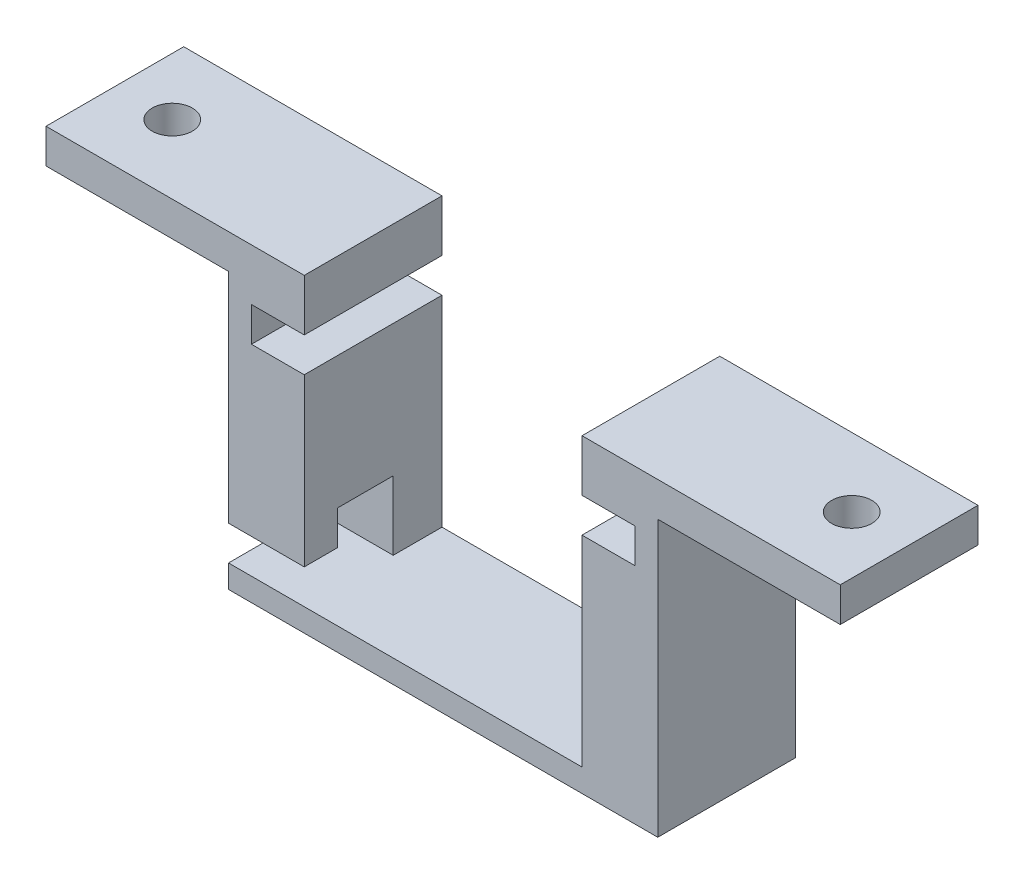
ISO-10303-21;
HEADER;
FILE_DESCRIPTION(('STEP AP214'),'2;1');
FILE_NAME('part.step','',(''),(''),'','','');
FILE_SCHEMA(('AUTOMOTIVE_DESIGN { 1 0 10303 214 1 1 1 1 }'));
ENDSEC;
DATA;
#1=APPLICATION_CONTEXT('core data for automotive mechanical design processes');
#2=APPLICATION_PROTOCOL_DEFINITION('international standard','automotive_design',2000,#1);
#3=PRODUCT_CONTEXT('',#1,'mechanical');
#4=PRODUCT('Part','Part','',(#3));
#5=PRODUCT_RELATED_PRODUCT_CATEGORY('part','',(#4));
#6=PRODUCT_DEFINITION_FORMATION('','',#4);
#7=PRODUCT_DEFINITION_CONTEXT('part definition',#1,'design');
#8=PRODUCT_DEFINITION('design','',#6,#7);
#9=PRODUCT_DEFINITION_SHAPE('','',#8);
#10=(LENGTH_UNIT() NAMED_UNIT(*) SI_UNIT(.MILLI.,.METRE.));
#11=(NAMED_UNIT(*) PLANE_ANGLE_UNIT() SI_UNIT($,.RADIAN.));
#12=(NAMED_UNIT(*) SI_UNIT($,.STERADIAN.) SOLID_ANGLE_UNIT());
#13=UNCERTAINTY_MEASURE_WITH_UNIT(LENGTH_MEASURE(1.E-05),#10,'distance_accuracy_value','');
#14=(GEOMETRIC_REPRESENTATION_CONTEXT(3) GLOBAL_UNCERTAINTY_ASSIGNED_CONTEXT((#13)) GLOBAL_UNIT_ASSIGNED_CONTEXT((#10,
#11,#12)) REPRESENTATION_CONTEXT('',''));
#15=CARTESIAN_POINT('',(0.,0.,0.));
#16=DIRECTION('',(0.,0.,1.));
#17=DIRECTION('',(1.,0.,0.));
#18=AXIS2_PLACEMENT_3D('',#15,#16,#17);
#19=CARTESIAN_POINT('',(-18.7,25.,12.));
#20=DIRECTION('',(1.,0.,0.));
#21=DIRECTION('',(0.,1.,0.));
#22=AXIS2_PLACEMENT_3D('',#19,#20,#21);
#23=PLANE('',#22);
#24=DIRECTION('',(0.,0.,1.));
#25=VECTOR('',#24,1.);
#26=CARTESIAN_POINT('',(-18.7,22.,12.));
#27=LINE('',#26,#25);
#28=CARTESIAN_POINT('',(-18.7,22.,0.));
#29=VERTEX_POINT('',#28);
#30=CARTESIAN_POINT('',(-18.7,22.,12.));
#31=VERTEX_POINT('',#30);
#32=EDGE_CURVE('E59',#29,#31,#27,.T.);
#33=ORIENTED_EDGE('',*,*,#32,.F.);
#34=DIRECTION('',(0.,-1.,0.));
#35=VECTOR('',#34,1.);
#36=CARTESIAN_POINT('',(-18.7,25.,0.));
#37=LINE('',#36,#35);
#38=CARTESIAN_POINT('',(-18.7,-2.,0.));
#39=VERTEX_POINT('',#38);
#40=EDGE_CURVE('E391',#29,#39,#37,.T.);
#41=ORIENTED_EDGE('',*,*,#40,.T.);
#42=DIRECTION('',(0.,0.,-1.));
#43=VECTOR('',#42,1.);
#44=CARTESIAN_POINT('',(-18.7,-2.,12.));
#45=LINE('',#44,#43);
#46=CARTESIAN_POINT('',(-18.7,-2.,12.));
#47=VERTEX_POINT('',#46);
#48=EDGE_CURVE('E48',#47,#39,#45,.T.);
#49=ORIENTED_EDGE('',*,*,#48,.F.);
#50=DIRECTION('',(0.,-1.,0.));
#51=VECTOR('',#50,1.);
#52=CARTESIAN_POINT('',(-18.7,25.,12.));
#53=LINE('',#52,#51);
#54=CARTESIAN_POINT('',(-18.7,0.,12.));
#55=VERTEX_POINT('',#54);
#56=EDGE_CURVE('E342',#55,#47,#53,.T.);
#57=ORIENTED_EDGE('',*,*,#56,.F.);
#58=DIRECTION('',(0.,0.,-1.));
#59=VECTOR('',#58,1.);
#60=CARTESIAN_POINT('',(-18.7,0.,12.));
#61=LINE('',#60,#59);
#62=CARTESIAN_POINT('',(-18.7,0.,4.25));
#63=VERTEX_POINT('',#62);
#64=EDGE_CURVE('E326',#55,#63,#61,.T.);
#65=ORIENTED_EDGE('',*,*,#64,.T.);
#66=DIRECTION('',(0.,1.,0.));
#67=VECTOR('',#66,1.);
#68=CARTESIAN_POINT('',(-18.7,25.,4.25000000000002));
#69=LINE('',#68,#67);
#70=CARTESIAN_POINT('',(-18.7,6.,4.25));
#71=VERTEX_POINT('',#70);
#72=EDGE_CURVE('E330',#63,#71,#69,.T.);
#73=ORIENTED_EDGE('',*,*,#72,.T.);
#74=DIRECTION('',(0.,0.,1.));
#75=VECTOR('',#74,1.);
#76=CARTESIAN_POINT('',(-18.7,6.,12.));
#77=LINE('',#76,#75);
#78=CARTESIAN_POINT('',(-18.7,6.,9.10764955179388));
#79=VERTEX_POINT('',#78);
#80=EDGE_CURVE('E320',#71,#79,#77,.T.);
#81=ORIENTED_EDGE('',*,*,#80,.T.);
#82=DIRECTION('',(0.,1.,0.));
#83=VECTOR('',#82,1.);
#84=CARTESIAN_POINT('',(-18.7,3.,9.10764955179388));
#85=LINE('',#84,#83);
#86=CARTESIAN_POINT('',(-18.7,3.,9.10764955179388));
#87=VERTEX_POINT('',#86);
#88=EDGE_CURVE('E305',#87,#79,#85,.T.);
#89=ORIENTED_EDGE('',*,*,#88,.F.);
#90=DIRECTION('',(0.,0.,-1.));
#91=VECTOR('',#90,1.);
#92=CARTESIAN_POINT('',(-18.7,3.,12.));
#93=LINE('',#92,#91);
#94=CARTESIAN_POINT('',(-18.7,3.,12.));
#95=VERTEX_POINT('',#94);
#96=EDGE_CURVE('E283',#95,#87,#93,.T.);
#97=ORIENTED_EDGE('',*,*,#96,.F.);
#98=EDGE_CURVE('E55',#31,#95,#53,.T.);
#99=ORIENTED_EDGE('',*,*,#98,.F.);
#100=EDGE_LOOP('',(#33,#41,#49,#57,#65,#73,#81,#89,#97,#99));
#101=FACE_BOUND('',#100,.T.);
#102=ADVANCED_FACE('F39',(#101),#23,.F.);
#103=CARTESIAN_POINT('',(-20.1,6.,7.75));
#104=DIRECTION('',(0.,1.,0.));
#105=DIRECTION('',(0.,0.,1.));
#106=AXIS2_PLACEMENT_3D('',#103,#104,#105);
#107=PLANE('',#106);
#108=DIRECTION('',(1.,0.,0.));
#109=VECTOR('',#108,1.);
#110=CARTESIAN_POINT('',(-18.7,6.,9.10764955179388));
#111=LINE('',#110,#109);
#112=CARTESIAN_POINT('',(-12.1,6.,9.10764955179388));
#113=VERTEX_POINT('',#112);
#114=EDGE_CURVE('E282',#79,#113,#111,.T.);
#115=ORIENTED_EDGE('',*,*,#114,.F.);
#116=ORIENTED_EDGE('',*,*,#80,.F.);
#117=DIRECTION('',(1.,0.,0.));
#118=VECTOR('',#117,1.);
#119=CARTESIAN_POINT('',(-20.1,6.,4.25));
#120=LINE('',#119,#118);
#121=CARTESIAN_POINT('',(-12.1,6.,4.25));
#122=VERTEX_POINT('',#121);
#123=EDGE_CURVE('E316',#71,#122,#120,.T.);
#124=ORIENTED_EDGE('',*,*,#123,.T.);
#125=DIRECTION('',(0.,0.,1.));
#126=VECTOR('',#125,1.);
#127=CARTESIAN_POINT('',(-12.1,6.,7.75));
#128=LINE('',#127,#126);
#129=EDGE_CURVE('E313',#122,#113,#128,.T.);
#130=ORIENTED_EDGE('',*,*,#129,.T.);
#131=EDGE_LOOP('',(#115,#116,#124,#130));
#132=FACE_BOUND('',#131,.T.);
#133=ADVANCED_FACE('F509',(#132),#107,.F.);
#134=CARTESIAN_POINT('',(0.,0.,12.));
#135=DIRECTION('',(0.,0.,1.));
#136=DIRECTION('',(1.,0.,0.));
#137=AXIS2_PLACEMENT_3D('',#134,#135,#136);
#138=PLANE('',#137);
#139=DIRECTION('',(0.,1.,0.));
#140=VECTOR('',#139,1.);
#141=CARTESIAN_POINT('',(18.7,-2.,12.));
#142=LINE('',#141,#140);
#143=CARTESIAN_POINT('',(18.7,-2.,12.));
#144=VERTEX_POINT('',#143);
#145=CARTESIAN_POINT('',(18.7,22.,12.));
#146=VERTEX_POINT('',#145);
#147=EDGE_CURVE('E348',#144,#146,#142,.T.);
#148=ORIENTED_EDGE('',*,*,#147,.T.);
#149=DIRECTION('',(1.,0.,0.));
#150=VECTOR('',#149,1.);
#151=CARTESIAN_POINT('',(12.1,22.,12.));
#152=LINE('',#151,#150);
#153=CARTESIAN_POINT('',(34.6,22.,12.));
#154=VERTEX_POINT('',#153);
#155=EDGE_CURVE('E220',#146,#154,#152,.T.);
#156=ORIENTED_EDGE('',*,*,#155,.T.);
#157=DIRECTION('',(0.,1.,0.));
#158=VECTOR('',#157,1.);
#159=CARTESIAN_POINT('',(34.6,22.,12.));
#160=LINE('',#159,#158);
#161=CARTESIAN_POINT('',(34.6,25.,12.));
#162=VERTEX_POINT('',#161);
#163=EDGE_CURVE('E219',#154,#162,#160,.T.);
#164=ORIENTED_EDGE('',*,*,#163,.T.);
#165=DIRECTION('',(-1.,0.,0.));
#166=VECTOR('',#165,1.);
#167=CARTESIAN_POINT('',(12.1,25.,12.));
#168=LINE('',#167,#166);
#169=CARTESIAN_POINT('',(12.1,25.,12.));
#170=VERTEX_POINT('',#169);
#171=EDGE_CURVE('E352',#162,#170,#168,.T.);
#172=ORIENTED_EDGE('',*,*,#171,.T.);
#173=DIRECTION('',(0.,-1.,0.));
#174=VECTOR('',#173,1.);
#175=CARTESIAN_POINT('',(12.1,20.5,12.));
#176=LINE('',#175,#174);
#177=CARTESIAN_POINT('',(12.1,20.5,12.));
#178=VERTEX_POINT('',#177);
#179=EDGE_CURVE('E355',#170,#178,#176,.T.);
#180=ORIENTED_EDGE('',*,*,#179,.T.);
#181=DIRECTION('',(1.,0.,0.));
#182=VECTOR('',#181,1.);
#183=CARTESIAN_POINT('',(16.7,20.5,12.));
#184=LINE('',#183,#182);
#185=CARTESIAN_POINT('',(16.7,20.5,12.));
#186=VERTEX_POINT('',#185);
#187=EDGE_CURVE('E358',#178,#186,#184,.T.);
#188=ORIENTED_EDGE('',*,*,#187,.T.);
#189=DIRECTION('',(0.,-1.,0.));
#190=VECTOR('',#189,1.);
#191=CARTESIAN_POINT('',(16.7,17.5,12.));
#192=LINE('',#191,#190);
#193=CARTESIAN_POINT('',(16.7,17.5,12.));
#194=VERTEX_POINT('',#193);
#195=EDGE_CURVE('E361',#186,#194,#192,.T.);
#196=ORIENTED_EDGE('',*,*,#195,.T.);
#197=DIRECTION('',(-1.,0.,0.));
#198=VECTOR('',#197,1.);
#199=CARTESIAN_POINT('',(12.1,17.5,12.));
#200=LINE('',#199,#198);
#201=CARTESIAN_POINT('',(12.1,17.5,12.));
#202=VERTEX_POINT('',#201);
#203=EDGE_CURVE('E364',#194,#202,#200,.T.);
#204=ORIENTED_EDGE('',*,*,#203,.T.);
#205=DIRECTION('',(0.,-1.,0.));
#206=VECTOR('',#205,1.);
#207=CARTESIAN_POINT('',(12.1,0.,12.));
#208=LINE('',#207,#206);
#209=CARTESIAN_POINT('',(12.1,0.,12.));
#210=VERTEX_POINT('',#209);
#211=EDGE_CURVE('E367',#202,#210,#208,.T.);
#212=ORIENTED_EDGE('',*,*,#211,.T.);
#213=DIRECTION('',(-1.,0.,0.));
#214=VECTOR('',#213,1.);
#215=CARTESIAN_POINT('',(-12.1,0.,12.));
#216=LINE('',#215,#214);
#217=EDGE_CURVE('E370',#210,#55,#216,.T.);
#218=ORIENTED_EDGE('',*,*,#217,.T.);
#219=ORIENTED_EDGE('',*,*,#56,.T.);
#220=DIRECTION('',(1.,0.,0.));
#221=VECTOR('',#220,1.);
#222=CARTESIAN_POINT('',(-18.7,-2.,12.));
#223=LINE('',#222,#221);
#224=EDGE_CURVE('E345',#47,#144,#223,.T.);
#225=ORIENTED_EDGE('',*,*,#224,.T.);
#226=EDGE_LOOP('',(#148,#156,#164,#172,#180,#188,#196,#204,#212,#218,#219,#225));
#227=FACE_BOUND('',#226,.T.);
#228=ADVANCED_FACE('F491',(#227),#138,.T.);
#229=CARTESIAN_POINT('',(-12.1,20.5,12.));
#230=DIRECTION('',(-1.,0.,0.));
#231=DIRECTION('',(0.,-1.,0.));
#232=AXIS2_PLACEMENT_3D('',#229,#230,#231);
#233=PLANE('',#232);
#234=DIRECTION('',(0.,0.,-1.));
#235=VECTOR('',#234,1.);
#236=CARTESIAN_POINT('',(-12.1,25.,12.));
#237=LINE('',#236,#235);
#238=CARTESIAN_POINT('',(-12.1,25.,12.));
#239=VERTEX_POINT('',#238);
#240=CARTESIAN_POINT('',(-12.1,25.,0.));
#241=VERTEX_POINT('',#240);
#242=EDGE_CURVE('E11',#239,#241,#237,.T.);
#243=ORIENTED_EDGE('',*,*,#242,.F.);
#244=DIRECTION('',(0.,1.,0.));
#245=VECTOR('',#244,1.);
#246=CARTESIAN_POINT('',(-12.1,20.5,12.));
#247=LINE('',#246,#245);
#248=CARTESIAN_POINT('',(-12.1,20.5,12.));
#249=VERTEX_POINT('',#248);
#250=EDGE_CURVE('E335',#249,#239,#247,.T.);
#251=ORIENTED_EDGE('',*,*,#250,.F.);
#252=DIRECTION('',(0.,0.,-1.));
#253=VECTOR('',#252,1.);
#254=CARTESIAN_POINT('',(-12.1,20.5,12.));
#255=LINE('',#254,#253);
#256=CARTESIAN_POINT('',(-12.1,20.5,0.));
#257=VERTEX_POINT('',#256);
#258=EDGE_CURVE('E385',#249,#257,#255,.T.);
#259=ORIENTED_EDGE('',*,*,#258,.T.);
#260=DIRECTION('',(0.,1.,0.));
#261=VECTOR('',#260,1.);
#262=CARTESIAN_POINT('',(-12.1,20.5,0.));
#263=LINE('',#262,#261);
#264=EDGE_CURVE('E334',#257,#241,#263,.T.);
#265=ORIENTED_EDGE('',*,*,#264,.T.);
#266=EDGE_LOOP('',(#243,#251,#259,#265));
#267=FACE_BOUND('',#266,.T.);
#268=ADVANCED_FACE('F41',(#267),#233,.F.);
#269=CARTESIAN_POINT('',(-12.1,25.,12.));
#270=DIRECTION('',(0.,-1.,0.));
#271=DIRECTION('',(1.,0.,0.));
#272=AXIS2_PLACEMENT_3D('',#269,#270,#271);
#273=PLANE('',#272);
#274=DIRECTION('',(-1.,0.,0.));
#275=VECTOR('',#274,1.);
#276=CARTESIAN_POINT('',(-12.1,25.,0.));
#277=LINE('',#276,#275);
#278=CARTESIAN_POINT('',(-34.6,25.,0.));
#279=VERTEX_POINT('',#278);
#280=EDGE_CURVE('E388',#241,#279,#277,.T.);
#281=ORIENTED_EDGE('',*,*,#280,.T.);
#282=DIRECTION('',(0.,0.,1.));
#283=VECTOR('',#282,1.);
#284=CARTESIAN_POINT('',(-34.6,25.,12.));
#285=LINE('',#284,#283);
#286=CARTESIAN_POINT('',(-34.6,25.,12.));
#287=VERTEX_POINT('',#286);
#288=EDGE_CURVE('E254',#279,#287,#285,.T.);
#289=ORIENTED_EDGE('',*,*,#288,.T.);
#290=DIRECTION('',(-1.,0.,0.));
#291=VECTOR('',#290,1.);
#292=CARTESIAN_POINT('',(-12.1,25.,12.));
#293=LINE('',#292,#291);
#294=EDGE_CURVE('E338',#239,#287,#293,.T.);
#295=ORIENTED_EDGE('',*,*,#294,.F.);
#296=ORIENTED_EDGE('',*,*,#242,.T.);
#297=EDGE_LOOP('',(#281,#289,#295,#296));
#298=FACE_BOUND('',#297,.T.);
#299=CARTESIAN_POINT('',(-29.6,25.,6.));
#300=DIRECTION('',(0.,1.,0.));
#301=DIRECTION('',(-1.,0.,0.));
#302=AXIS2_PLACEMENT_3D('',#299,#300,#301);
#303=CIRCLE('',#302,1.75);
#304=CARTESIAN_POINT('',(-31.35,25.,6.));
#305=VERTEX_POINT('',#304);
#306=EDGE_CURVE('E249',#305,#305,#303,.T.);
#307=ORIENTED_EDGE('',*,*,#306,.F.);
#308=EDGE_LOOP('',(#307));
#309=FACE_BOUND('',#308,.T.);
#310=ADVANCED_FACE('F530',(#298,#309),#273,.F.);
#311=CARTESIAN_POINT('',(-18.7,-2.,12.));
#312=DIRECTION('',(0.,1.,0.));
#313=DIRECTION('',(0.,0.,1.));
#314=AXIS2_PLACEMENT_3D('',#311,#312,#313);
#315=PLANE('',#314);
#316=DIRECTION('',(1.,0.,0.));
#317=VECTOR('',#316,1.);
#318=CARTESIAN_POINT('',(-18.7,-2.,0.));
#319=LINE('',#318,#317);
#320=CARTESIAN_POINT('',(18.7,-2.,0.));
#321=VERTEX_POINT('',#320);
#322=EDGE_CURVE('E394',#39,#321,#319,.T.);
#323=ORIENTED_EDGE('',*,*,#322,.T.);
#324=DIRECTION('',(0.,0.,-1.));
#325=VECTOR('',#324,1.);
#326=CARTESIAN_POINT('',(18.7,-2.,12.));
#327=LINE('',#326,#325);
#328=EDGE_CURVE('E474',#144,#321,#327,.T.);
#329=ORIENTED_EDGE('',*,*,#328,.F.);
#330=ORIENTED_EDGE('',*,*,#224,.F.);
#331=ORIENTED_EDGE('',*,*,#48,.T.);
#332=EDGE_LOOP('',(#323,#329,#330,#331));
#333=FACE_BOUND('',#332,.T.);
#334=ADVANCED_FACE('F483',(#333),#315,.F.);
#335=CARTESIAN_POINT('',(18.7,-2.,12.));
#336=DIRECTION('',(-1.,0.,0.));
#337=DIRECTION('',(0.,-1.,0.));
#338=AXIS2_PLACEMENT_3D('',#335,#336,#337);
#339=PLANE('',#338);
#340=DIRECTION('',(0.,1.,0.));
#341=VECTOR('',#340,1.);
#342=CARTESIAN_POINT('',(18.7,-2.,0.));
#343=LINE('',#342,#341);
#344=CARTESIAN_POINT('',(18.7,22.,0.));
#345=VERTEX_POINT('',#344);
#346=EDGE_CURVE('E397',#321,#345,#343,.T.);
#347=ORIENTED_EDGE('',*,*,#346,.T.);
#348=DIRECTION('',(0.,0.,1.));
#349=VECTOR('',#348,1.);
#350=CARTESIAN_POINT('',(18.7,22.,12.));
#351=LINE('',#350,#349);
#352=EDGE_CURVE('E227',#345,#146,#351,.T.);
#353=ORIENTED_EDGE('',*,*,#352,.T.);
#354=ORIENTED_EDGE('',*,*,#147,.F.);
#355=ORIENTED_EDGE('',*,*,#328,.T.);
#356=EDGE_LOOP('',(#347,#353,#354,#355));
#357=FACE_BOUND('',#356,.T.);
#358=ADVANCED_FACE('F488',(#357),#339,.F.);
#359=CARTESIAN_POINT('',(12.1,25.,12.));
#360=DIRECTION('',(0.,-1.,0.));
#361=DIRECTION('',(1.,0.,0.));
#362=AXIS2_PLACEMENT_3D('',#359,#360,#361);
#363=PLANE('',#362);
#364=DIRECTION('',(-1.,0.,0.));
#365=VECTOR('',#364,1.);
#366=CARTESIAN_POINT('',(12.1,25.,0.));
#367=LINE('',#366,#365);
#368=CARTESIAN_POINT('',(34.6,25.,0.));
#369=VERTEX_POINT('',#368);
#370=CARTESIAN_POINT('',(12.1,25.,0.));
#371=VERTEX_POINT('',#370);
#372=EDGE_CURVE('E213',#369,#371,#367,.T.);
#373=ORIENTED_EDGE('',*,*,#372,.T.);
#374=DIRECTION('',(0.,0.,-1.));
#375=VECTOR('',#374,1.);
#376=CARTESIAN_POINT('',(12.1,25.,12.));
#377=LINE('',#376,#375);
#378=EDGE_CURVE('E470',#170,#371,#377,.T.);
#379=ORIENTED_EDGE('',*,*,#378,.F.);
#380=ORIENTED_EDGE('',*,*,#171,.F.);
#381=DIRECTION('',(0.,0.,-1.));
#382=VECTOR('',#381,1.);
#383=CARTESIAN_POINT('',(34.6,25.,12.));
#384=LINE('',#383,#382);
#385=EDGE_CURVE('E234',#162,#369,#384,.T.);
#386=ORIENTED_EDGE('',*,*,#385,.T.);
#387=EDGE_LOOP('',(#373,#379,#380,#386));
#388=FACE_BOUND('',#387,.T.);
#389=CARTESIAN_POINT('',(29.6,25.,6.));
#390=DIRECTION('',(0.,1.,0.));
#391=DIRECTION('',(-1.,0.,0.));
#392=AXIS2_PLACEMENT_3D('',#389,#390,#391);
#393=CIRCLE('',#392,1.75);
#394=CARTESIAN_POINT('',(27.85,25.,6.));
#395=VERTEX_POINT('',#394);
#396=EDGE_CURVE('E240',#395,#395,#393,.T.);
#397=ORIENTED_EDGE('',*,*,#396,.F.);
#398=EDGE_LOOP('',(#397));
#399=FACE_BOUND('',#398,.T.);
#400=ADVANCED_FACE('F661',(#388,#399),#363,.F.);
#401=CARTESIAN_POINT('',(12.1,20.5,12.));
#402=DIRECTION('',(1.,0.,0.));
#403=DIRECTION('',(0.,1.,0.));
#404=AXIS2_PLACEMENT_3D('',#401,#402,#403);
#405=PLANE('',#404);
#406=DIRECTION('',(0.,0.,-1.));
#407=VECTOR('',#406,1.);
#408=CARTESIAN_POINT('',(12.1,20.5,12.));
#409=LINE('',#408,#407);
#410=CARTESIAN_POINT('',(12.1,20.5,0.));
#411=VERTEX_POINT('',#410);
#412=EDGE_CURVE('E466',#178,#411,#409,.T.);
#413=ORIENTED_EDGE('',*,*,#412,.F.);
#414=ORIENTED_EDGE('',*,*,#179,.F.);
#415=ORIENTED_EDGE('',*,*,#378,.T.);
#416=DIRECTION('',(0.,-1.,0.));
#417=VECTOR('',#416,1.);
#418=CARTESIAN_POINT('',(12.1,20.5,0.));
#419=LINE('',#418,#417);
#420=EDGE_CURVE('E402',#371,#411,#419,.T.);
#421=ORIENTED_EDGE('',*,*,#420,.T.);
#422=EDGE_LOOP('',(#413,#414,#415,#421));
#423=FACE_BOUND('',#422,.T.);
#424=ADVANCED_FACE('F642',(#423),#405,.F.);
#425=CARTESIAN_POINT('',(16.7,20.5,12.));
#426=DIRECTION('',(0.,1.,0.));
#427=DIRECTION('',(-1.,0.,0.));
#428=AXIS2_PLACEMENT_3D('',#425,#426,#427);
#429=PLANE('',#428);
#430=DIRECTION('',(1.,0.,0.));
#431=VECTOR('',#430,1.);
#432=CARTESIAN_POINT('',(16.7,20.5,0.));
#433=LINE('',#432,#431);
#434=CARTESIAN_POINT('',(16.7,20.5,0.));
#435=VERTEX_POINT('',#434);
#436=EDGE_CURVE('E405',#411,#435,#433,.T.);
#437=ORIENTED_EDGE('',*,*,#436,.T.);
#438=DIRECTION('',(0.,0.,-1.));
#439=VECTOR('',#438,1.);
#440=CARTESIAN_POINT('',(16.7,20.5,12.));
#441=LINE('',#440,#439);
#442=EDGE_CURVE('E462',#186,#435,#441,.T.);
#443=ORIENTED_EDGE('',*,*,#442,.F.);
#444=ORIENTED_EDGE('',*,*,#187,.F.);
#445=ORIENTED_EDGE('',*,*,#412,.T.);
#446=EDGE_LOOP('',(#437,#443,#444,#445));
#447=FACE_BOUND('',#446,.T.);
#448=ADVANCED_FACE('F632',(#447),#429,.F.);
#449=CARTESIAN_POINT('',(16.7,17.5,12.));
#450=DIRECTION('',(1.,0.,0.));
#451=DIRECTION('',(0.,0.,-1.));
#452=AXIS2_PLACEMENT_3D('',#449,#450,#451);
#453=PLANE('',#452);
#454=DIRECTION('',(0.,-1.,0.));
#455=VECTOR('',#454,1.);
#456=CARTESIAN_POINT('',(16.7,17.5,0.));
#457=LINE('',#456,#455);
#458=CARTESIAN_POINT('',(16.7,17.5,0.));
#459=VERTEX_POINT('',#458);
#460=EDGE_CURVE('E408',#435,#459,#457,.T.);
#461=ORIENTED_EDGE('',*,*,#460,.T.);
#462=DIRECTION('',(0.,0.,-1.));
#463=VECTOR('',#462,1.);
#464=CARTESIAN_POINT('',(16.7,17.5,12.));
#465=LINE('',#464,#463);
#466=EDGE_CURVE('E458',#194,#459,#465,.T.);
#467=ORIENTED_EDGE('',*,*,#466,.F.);
#468=ORIENTED_EDGE('',*,*,#195,.F.);
#469=ORIENTED_EDGE('',*,*,#442,.T.);
#470=EDGE_LOOP('',(#461,#467,#468,#469));
#471=FACE_BOUND('',#470,.T.);
#472=ADVANCED_FACE('F622',(#471),#453,.F.);
#473=CARTESIAN_POINT('',(12.1,17.5,12.));
#474=DIRECTION('',(0.,-1.,0.));
#475=DIRECTION('',(0.,0.,-1.));
#476=AXIS2_PLACEMENT_3D('',#473,#474,#475);
#477=PLANE('',#476);
#478=DIRECTION('',(-1.,0.,0.));
#479=VECTOR('',#478,1.);
#480=CARTESIAN_POINT('',(12.1,17.5,0.));
#481=LINE('',#480,#479);
#482=CARTESIAN_POINT('',(12.1,17.5,0.));
#483=VERTEX_POINT('',#482);
#484=EDGE_CURVE('E411',#459,#483,#481,.T.);
#485=ORIENTED_EDGE('',*,*,#484,.T.);
#486=DIRECTION('',(0.,0.,-1.));
#487=VECTOR('',#486,1.);
#488=CARTESIAN_POINT('',(12.1,17.5,12.));
#489=LINE('',#488,#487);
#490=EDGE_CURVE('E454',#202,#483,#489,.T.);
#491=ORIENTED_EDGE('',*,*,#490,.F.);
#492=ORIENTED_EDGE('',*,*,#203,.F.);
#493=ORIENTED_EDGE('',*,*,#466,.T.);
#494=EDGE_LOOP('',(#485,#491,#492,#493));
#495=FACE_BOUND('',#494,.T.);
#496=ADVANCED_FACE('F610',(#495),#477,.F.);
#497=CARTESIAN_POINT('',(12.1,0.,12.));
#498=DIRECTION('',(1.,0.,0.));
#499=DIRECTION('',(0.,1.,0.));
#500=AXIS2_PLACEMENT_3D('',#497,#498,#499);
#501=PLANE('',#500);
#502=DIRECTION('',(0.,-1.,0.));
#503=VECTOR('',#502,1.);
#504=CARTESIAN_POINT('',(12.1,0.,0.));
#505=LINE('',#504,#503);
#506=CARTESIAN_POINT('',(12.1,0.,0.));
#507=VERTEX_POINT('',#506);
#508=EDGE_CURVE('E414',#483,#507,#505,.T.);
#509=ORIENTED_EDGE('',*,*,#508,.T.);
#510=DIRECTION('',(0.,0.,-1.));
#511=VECTOR('',#510,1.);
#512=CARTESIAN_POINT('',(12.1,0.,12.));
#513=LINE('',#512,#511);
#514=EDGE_CURVE('E450',#210,#507,#513,.T.);
#515=ORIENTED_EDGE('',*,*,#514,.F.);
#516=ORIENTED_EDGE('',*,*,#211,.F.);
#517=ORIENTED_EDGE('',*,*,#490,.T.);
#518=EDGE_LOOP('',(#509,#515,#516,#517));
#519=FACE_BOUND('',#518,.T.);
#520=ADVANCED_FACE('F605',(#519),#501,.F.);
#521=CARTESIAN_POINT('',(-12.1,0.,12.));
#522=DIRECTION('',(0.,-1.,0.));
#523=DIRECTION('',(1.,0.,0.));
#524=AXIS2_PLACEMENT_3D('',#521,#522,#523);
#525=PLANE('',#524);
#526=DIRECTION('',(-1.,0.,0.));
#527=VECTOR('',#526,1.);
#528=CARTESIAN_POINT('',(-12.1,0.,0.));
#529=LINE('',#528,#527);
#530=CARTESIAN_POINT('',(-12.1,0.,0.));
#531=VERTEX_POINT('',#530);
#532=EDGE_CURVE('E417',#507,#531,#529,.T.);
#533=ORIENTED_EDGE('',*,*,#532,.T.);
#534=DIRECTION('',(0.,0.,-1.));
#535=VECTOR('',#534,1.);
#536=CARTESIAN_POINT('',(-12.1,0.,12.));
#537=LINE('',#536,#535);
#538=CARTESIAN_POINT('',(-12.1,0.,4.25));
#539=VERTEX_POINT('',#538);
#540=EDGE_CURVE('E447',#539,#531,#537,.T.);
#541=ORIENTED_EDGE('',*,*,#540,.F.);
#542=DIRECTION('',(1.,0.,0.));
#543=VECTOR('',#542,1.);
#544=CARTESIAN_POINT('',(-20.1,0.,4.25));
#545=LINE('',#544,#543);
#546=EDGE_CURVE('E317',#63,#539,#545,.T.);
#547=ORIENTED_EDGE('',*,*,#546,.F.);
#548=ORIENTED_EDGE('',*,*,#64,.F.);
#549=ORIENTED_EDGE('',*,*,#217,.F.);
#550=ORIENTED_EDGE('',*,*,#514,.T.);
#551=EDGE_LOOP('',(#533,#541,#547,#548,#549,#550));
#552=FACE_BOUND('',#551,.T.);
#553=ADVANCED_FACE('F497',(#552),#525,.F.);
#554=CARTESIAN_POINT('',(-12.1,0.,12.));
#555=DIRECTION('',(-1.,0.,0.));
#556=DIRECTION('',(0.,0.,1.));
#557=AXIS2_PLACEMENT_3D('',#554,#555,#556);
#558=PLANE('',#557);
#559=ORIENTED_EDGE('',*,*,#129,.F.);
#560=DIRECTION('',(0.,1.,0.));
#561=VECTOR('',#560,1.);
#562=CARTESIAN_POINT('',(-12.1,0.,4.25));
#563=LINE('',#562,#561);
#564=EDGE_CURVE('E309',#539,#122,#563,.T.);
#565=ORIENTED_EDGE('',*,*,#564,.F.);
#566=ORIENTED_EDGE('',*,*,#540,.T.);
#567=DIRECTION('',(0.,1.,0.));
#568=VECTOR('',#567,1.);
#569=CARTESIAN_POINT('',(-12.1,0.,0.));
#570=LINE('',#569,#568);
#571=CARTESIAN_POINT('',(-12.1,17.5,0.));
#572=VERTEX_POINT('',#571);
#573=EDGE_CURVE('E421',#531,#572,#570,.T.);
#574=ORIENTED_EDGE('',*,*,#573,.T.);
#575=DIRECTION('',(0.,0.,-1.));
#576=VECTOR('',#575,1.);
#577=CARTESIAN_POINT('',(-12.1,17.5,12.));
#578=LINE('',#577,#576);
#579=CARTESIAN_POINT('',(-12.1,17.5,12.));
#580=VERTEX_POINT('',#579);
#581=EDGE_CURVE('E443',#580,#572,#578,.T.);
#582=ORIENTED_EDGE('',*,*,#581,.F.);
#583=DIRECTION('',(0.,1.,0.));
#584=VECTOR('',#583,1.);
#585=CARTESIAN_POINT('',(-12.1,0.,12.));
#586=LINE('',#585,#584);
#587=CARTESIAN_POINT('',(-12.1,3.,12.));
#588=VERTEX_POINT('',#587);
#589=EDGE_CURVE('E373',#588,#580,#586,.T.);
#590=ORIENTED_EDGE('',*,*,#589,.F.);
#591=DIRECTION('',(0.,0.,1.));
#592=VECTOR('',#591,1.);
#593=CARTESIAN_POINT('',(-12.1,3.,12.));
#594=LINE('',#593,#592);
#595=CARTESIAN_POINT('',(-12.1,3.,9.10764955179388));
#596=VERTEX_POINT('',#595);
#597=EDGE_CURVE('E290',#596,#588,#594,.T.);
#598=ORIENTED_EDGE('',*,*,#597,.F.);
#599=DIRECTION('',(0.,1.,0.));
#600=VECTOR('',#599,1.);
#601=CARTESIAN_POINT('',(-12.1,3.,9.10764955179388));
#602=LINE('',#601,#600);
#603=EDGE_CURVE('E298',#596,#113,#602,.T.);
#604=ORIENTED_EDGE('',*,*,#603,.T.);
#605=EDGE_LOOP('',(#559,#565,#566,#574,#582,#590,#598,#604));
#606=FACE_BOUND('',#605,.T.);
#607=ADVANCED_FACE('F505',(#606),#558,.F.);
#608=CARTESIAN_POINT('',(-12.1,17.5,12.));
#609=DIRECTION('',(0.,-1.,0.));
#610=DIRECTION('',(0.,0.,-1.));
#611=AXIS2_PLACEMENT_3D('',#608,#609,#610);
#612=PLANE('',#611);
#613=DIRECTION('',(-1.,0.,0.));
#614=VECTOR('',#613,1.);
#615=CARTESIAN_POINT('',(-12.1,17.5,0.));
#616=LINE('',#615,#614);
#617=CARTESIAN_POINT('',(-16.7,17.5,0.));
#618=VERTEX_POINT('',#617);
#619=EDGE_CURVE('E424',#572,#618,#616,.T.);
#620=ORIENTED_EDGE('',*,*,#619,.T.);
#621=DIRECTION('',(0.,0.,-1.));
#622=VECTOR('',#621,1.);
#623=CARTESIAN_POINT('',(-16.7,17.5,12.));
#624=LINE('',#623,#622);
#625=CARTESIAN_POINT('',(-16.7,17.5,12.));
#626=VERTEX_POINT('',#625);
#627=EDGE_CURVE('E439',#626,#618,#624,.T.);
#628=ORIENTED_EDGE('',*,*,#627,.F.);
#629=DIRECTION('',(-1.,0.,0.));
#630=VECTOR('',#629,1.);
#631=CARTESIAN_POINT('',(-12.1,17.5,12.));
#632=LINE('',#631,#630);
#633=EDGE_CURVE('E376',#580,#626,#632,.T.);
#634=ORIENTED_EDGE('',*,*,#633,.F.);
#635=ORIENTED_EDGE('',*,*,#581,.T.);
#636=EDGE_LOOP('',(#620,#628,#634,#635));
#637=FACE_BOUND('',#636,.T.);
#638=ADVANCED_FACE('F551',(#637),#612,.F.);
#639=CARTESIAN_POINT('',(-16.7,17.5,12.));
#640=DIRECTION('',(-1.,0.,0.));
#641=DIRECTION('',(0.,0.,1.));
#642=AXIS2_PLACEMENT_3D('',#639,#640,#641);
#643=PLANE('',#642);
#644=DIRECTION('',(0.,1.,0.));
#645=VECTOR('',#644,1.);
#646=CARTESIAN_POINT('',(-16.7,17.5,0.));
#647=LINE('',#646,#645);
#648=CARTESIAN_POINT('',(-16.7,20.5,0.));
#649=VERTEX_POINT('',#648);
#650=EDGE_CURVE('E427',#618,#649,#647,.T.);
#651=ORIENTED_EDGE('',*,*,#650,.T.);
#652=DIRECTION('',(0.,0.,-1.));
#653=VECTOR('',#652,1.);
#654=CARTESIAN_POINT('',(-16.7,20.5,12.));
#655=LINE('',#654,#653);
#656=CARTESIAN_POINT('',(-16.7,20.5,12.));
#657=VERTEX_POINT('',#656);
#658=EDGE_CURVE('E435',#657,#649,#655,.T.);
#659=ORIENTED_EDGE('',*,*,#658,.F.);
#660=DIRECTION('',(0.,1.,0.));
#661=VECTOR('',#660,1.);
#662=CARTESIAN_POINT('',(-16.7,17.5,12.));
#663=LINE('',#662,#661);
#664=EDGE_CURVE('E379',#626,#657,#663,.T.);
#665=ORIENTED_EDGE('',*,*,#664,.F.);
#666=ORIENTED_EDGE('',*,*,#627,.T.);
#667=EDGE_LOOP('',(#651,#659,#665,#666));
#668=FACE_BOUND('',#667,.T.);
#669=ADVANCED_FACE('F545',(#668),#643,.F.);
#670=CARTESIAN_POINT('',(-16.7,20.5,12.));
#671=DIRECTION('',(0.,1.,0.));
#672=DIRECTION('',(0.,0.,1.));
#673=AXIS2_PLACEMENT_3D('',#670,#671,#672);
#674=PLANE('',#673);
#675=DIRECTION('',(1.,0.,0.));
#676=VECTOR('',#675,1.);
#677=CARTESIAN_POINT('',(-16.7,20.5,0.));
#678=LINE('',#677,#676);
#679=EDGE_CURVE('E339',#649,#257,#678,.T.);
#680=ORIENTED_EDGE('',*,*,#679,.T.);
#681=ORIENTED_EDGE('',*,*,#258,.F.);
#682=DIRECTION('',(1.,0.,0.));
#683=VECTOR('',#682,1.);
#684=CARTESIAN_POINT('',(-16.7,20.5,12.));
#685=LINE('',#684,#683);
#686=EDGE_CURVE('E382',#657,#249,#685,.T.);
#687=ORIENTED_EDGE('',*,*,#686,.F.);
#688=ORIENTED_EDGE('',*,*,#658,.T.);
#689=EDGE_LOOP('',(#680,#681,#687,#688));
#690=FACE_BOUND('',#689,.T.);
#691=ADVANCED_FACE('F541',(#690),#674,.F.);
#692=ORIENTED_EDGE('',*,*,#294,.T.);
#693=DIRECTION('',(0.,1.,0.));
#694=VECTOR('',#693,1.);
#695=CARTESIAN_POINT('',(-34.6,22.,12.));
#696=LINE('',#695,#694);
#697=CARTESIAN_POINT('',(-34.6,22.,12.));
#698=VERTEX_POINT('',#697);
#699=EDGE_CURVE('E273',#698,#287,#696,.T.);
#700=ORIENTED_EDGE('',*,*,#699,.F.);
#701=DIRECTION('',(1.,0.,0.));
#702=VECTOR('',#701,1.);
#703=CARTESIAN_POINT('',(-12.1,22.,12.));
#704=LINE('',#703,#702);
#705=EDGE_CURVE('E265',#698,#31,#704,.T.);
#706=ORIENTED_EDGE('',*,*,#705,.T.);
#707=ORIENTED_EDGE('',*,*,#98,.T.);
#708=DIRECTION('',(-1.,0.,0.));
#709=VECTOR('',#708,1.);
#710=CARTESIAN_POINT('',(-18.7,3.,12.));
#711=LINE('',#710,#709);
#712=EDGE_CURVE('E294',#588,#95,#711,.T.);
#713=ORIENTED_EDGE('',*,*,#712,.F.);
#714=ORIENTED_EDGE('',*,*,#589,.T.);
#715=ORIENTED_EDGE('',*,*,#633,.T.);
#716=ORIENTED_EDGE('',*,*,#664,.T.);
#717=ORIENTED_EDGE('',*,*,#686,.T.);
#718=ORIENTED_EDGE('',*,*,#250,.T.);
#719=EDGE_LOOP('',(#692,#700,#706,#707,#713,#714,#715,#716,#717,#718));
#720=FACE_BOUND('',#719,.T.);
#721=ADVANCED_FACE('F517',(#720),#138,.T.);
#722=CARTESIAN_POINT('',(0.,0.,0.));
#723=DIRECTION('',(0.,0.,1.));
#724=DIRECTION('',(1.,0.,0.));
#725=AXIS2_PLACEMENT_3D('',#722,#723,#724);
#726=PLANE('',#725);
#727=ORIENTED_EDGE('',*,*,#436,.F.);
#728=ORIENTED_EDGE('',*,*,#420,.F.);
#729=ORIENTED_EDGE('',*,*,#372,.F.);
#730=DIRECTION('',(0.,1.,0.));
#731=VECTOR('',#730,1.);
#732=CARTESIAN_POINT('',(34.6,22.,0.));
#733=LINE('',#732,#731);
#734=CARTESIAN_POINT('',(34.6,22.,0.));
#735=VERTEX_POINT('',#734);
#736=EDGE_CURVE('E205',#735,#369,#733,.T.);
#737=ORIENTED_EDGE('',*,*,#736,.F.);
#738=DIRECTION('',(-1.,0.,0.));
#739=VECTOR('',#738,1.);
#740=CARTESIAN_POINT('',(12.1,22.,0.));
#741=LINE('',#740,#739);
#742=EDGE_CURVE('E210',#735,#345,#741,.T.);
#743=ORIENTED_EDGE('',*,*,#742,.T.);
#744=ORIENTED_EDGE('',*,*,#346,.F.);
#745=ORIENTED_EDGE('',*,*,#322,.F.);
#746=ORIENTED_EDGE('',*,*,#40,.F.);
#747=DIRECTION('',(-1.,0.,0.));
#748=VECTOR('',#747,1.);
#749=CARTESIAN_POINT('',(-12.1,22.,0.));
#750=LINE('',#749,#748);
#751=CARTESIAN_POINT('',(-34.6,22.,0.));
#752=VERTEX_POINT('',#751);
#753=EDGE_CURVE('E258',#29,#752,#750,.T.);
#754=ORIENTED_EDGE('',*,*,#753,.T.);
#755=DIRECTION('',(0.,1.,0.));
#756=VECTOR('',#755,1.);
#757=CARTESIAN_POINT('',(-34.6,22.,0.));
#758=LINE('',#757,#756);
#759=EDGE_CURVE('E269',#752,#279,#758,.T.);
#760=ORIENTED_EDGE('',*,*,#759,.T.);
#761=ORIENTED_EDGE('',*,*,#280,.F.);
#762=ORIENTED_EDGE('',*,*,#264,.F.);
#763=ORIENTED_EDGE('',*,*,#679,.F.);
#764=ORIENTED_EDGE('',*,*,#650,.F.);
#765=ORIENTED_EDGE('',*,*,#619,.F.);
#766=ORIENTED_EDGE('',*,*,#573,.F.);
#767=ORIENTED_EDGE('',*,*,#532,.F.);
#768=ORIENTED_EDGE('',*,*,#508,.F.);
#769=ORIENTED_EDGE('',*,*,#484,.F.);
#770=ORIENTED_EDGE('',*,*,#460,.F.);
#771=EDGE_LOOP('',(#727,#728,#729,#737,#743,#744,#745,#746,#754,#760,#761,#762,#763,#764,#765,
#766,#767,#768,#769,#770));
#772=FACE_BOUND('',#771,.T.);
#773=ADVANCED_FACE('F208',(#772),#726,.F.);
#774=CARTESIAN_POINT('',(-20.1,0.,4.25));
#775=DIRECTION('',(0.,0.,-1.));
#776=DIRECTION('',(0.,1.,0.));
#777=AXIS2_PLACEMENT_3D('',#774,#775,#776);
#778=PLANE('',#777);
#779=ORIENTED_EDGE('',*,*,#546,.T.);
#780=ORIENTED_EDGE('',*,*,#564,.T.);
#781=ORIENTED_EDGE('',*,*,#123,.F.);
#782=ORIENTED_EDGE('',*,*,#72,.F.);
#783=EDGE_LOOP('',(#779,#780,#781,#782));
#784=FACE_BOUND('',#783,.T.);
#785=ADVANCED_FACE('F501',(#784),#778,.F.);
#786=CARTESIAN_POINT('',(-18.7,3.,9.10764955179388));
#787=DIRECTION('',(0.,0.,1.));
#788=DIRECTION('',(1.,0.,0.));
#789=AXIS2_PLACEMENT_3D('',#786,#787,#788);
#790=PLANE('',#789);
#791=ORIENTED_EDGE('',*,*,#114,.T.);
#792=ORIENTED_EDGE('',*,*,#603,.F.);
#793=DIRECTION('',(1.,0.,0.));
#794=VECTOR('',#793,1.);
#795=CARTESIAN_POINT('',(-18.7,3.,9.10764955179388));
#796=LINE('',#795,#794);
#797=EDGE_CURVE('E287',#87,#596,#796,.T.);
#798=ORIENTED_EDGE('',*,*,#797,.F.);
#799=ORIENTED_EDGE('',*,*,#88,.T.);
#800=EDGE_LOOP('',(#791,#792,#798,#799));
#801=FACE_BOUND('',#800,.T.);
#802=ADVANCED_FACE('F511',(#801),#790,.F.);
#803=CARTESIAN_POINT('',(0.,3.,0.));
#804=DIRECTION('',(0.,-1.,0.));
#805=DIRECTION('',(0.,0.,-1.));
#806=AXIS2_PLACEMENT_3D('',#803,#804,#805);
#807=PLANE('',#806);
#808=ORIENTED_EDGE('',*,*,#96,.T.);
#809=ORIENTED_EDGE('',*,*,#797,.T.);
#810=ORIENTED_EDGE('',*,*,#597,.T.);
#811=ORIENTED_EDGE('',*,*,#712,.T.);
#812=EDGE_LOOP('',(#808,#809,#810,#811));
#813=FACE_BOUND('',#812,.T.);
#814=ADVANCED_FACE('F514',(#813),#807,.T.);
#815=CARTESIAN_POINT('',(0.,22.,0.));
#816=DIRECTION('',(0.,1.,0.));
#817=DIRECTION('',(-1.,0.,0.));
#818=AXIS2_PLACEMENT_3D('',#815,#816,#817);
#819=PLANE('',#818);
#820=CARTESIAN_POINT('',(-29.6,22.,6.));
#821=DIRECTION('',(0.,1.,0.));
#822=DIRECTION('',(-1.,0.,0.));
#823=AXIS2_PLACEMENT_3D('',#820,#821,#822);
#824=CIRCLE('',#823,1.75);
#825=CARTESIAN_POINT('',(-31.35,22.,6.));
#826=VERTEX_POINT('',#825);
#827=EDGE_CURVE('E250',#826,#826,#824,.T.);
#828=ORIENTED_EDGE('',*,*,#827,.T.);
#829=EDGE_LOOP('',(#828));
#830=FACE_BOUND('',#829,.T.);
#831=ORIENTED_EDGE('',*,*,#753,.F.);
#832=ORIENTED_EDGE('',*,*,#32,.T.);
#833=ORIENTED_EDGE('',*,*,#705,.F.);
#834=DIRECTION('',(0.,0.,1.));
#835=VECTOR('',#834,1.);
#836=CARTESIAN_POINT('',(-34.6,22.,12.));
#837=LINE('',#836,#835);
#838=EDGE_CURVE('E261',#752,#698,#837,.T.);
#839=ORIENTED_EDGE('',*,*,#838,.F.);
#840=EDGE_LOOP('',(#831,#832,#833,#839));
#841=FACE_BOUND('',#840,.T.);
#842=ADVANCED_FACE('F522',(#830,#841),#819,.F.);
#843=CARTESIAN_POINT('',(-34.6,22.,12.));
#844=DIRECTION('',(-1.,0.,0.));
#845=DIRECTION('',(0.,-1.,0.));
#846=AXIS2_PLACEMENT_3D('',#843,#844,#845);
#847=PLANE('',#846);
#848=ORIENTED_EDGE('',*,*,#288,.F.);
#849=ORIENTED_EDGE('',*,*,#759,.F.);
#850=ORIENTED_EDGE('',*,*,#838,.T.);
#851=ORIENTED_EDGE('',*,*,#699,.T.);
#852=EDGE_LOOP('',(#848,#849,#850,#851));
#853=FACE_BOUND('',#852,.T.);
#854=ADVANCED_FACE('F527',(#853),#847,.T.);
#855=CARTESIAN_POINT('',(-29.6,22.,6.));
#856=DIRECTION('',(0.,1.,0.));
#857=DIRECTION('',(-1.,0.,0.));
#858=AXIS2_PLACEMENT_3D('',#855,#856,#857);
#859=CYLINDRICAL_SURFACE('',#858,1.75);
#860=ORIENTED_EDGE('',*,*,#827,.F.);
#861=EDGE_LOOP('',(#860));
#862=FACE_BOUND('',#861,.T.);
#863=ORIENTED_EDGE('',*,*,#306,.T.);
#864=EDGE_LOOP('',(#863));
#865=FACE_BOUND('',#864,.T.);
#866=ADVANCED_FACE('F705',(#862,#865),#859,.F.);
#867=CARTESIAN_POINT('',(0.,22.,0.));
#868=DIRECTION('',(0.,-1.,0.));
#869=DIRECTION('',(1.,0.,0.));
#870=AXIS2_PLACEMENT_3D('',#867,#868,#869);
#871=PLANE('',#870);
#872=CARTESIAN_POINT('',(29.6,22.,6.));
#873=DIRECTION('',(0.,1.,0.));
#874=DIRECTION('',(-1.,0.,0.));
#875=AXIS2_PLACEMENT_3D('',#872,#873,#874);
#876=CIRCLE('',#875,1.75);
#877=CARTESIAN_POINT('',(27.85,22.,6.));
#878=VERTEX_POINT('',#877);
#879=EDGE_CURVE('E237',#878,#878,#876,.T.);
#880=ORIENTED_EDGE('',*,*,#879,.T.);
#881=EDGE_LOOP('',(#880));
#882=FACE_BOUND('',#881,.T.);
#883=ORIENTED_EDGE('',*,*,#352,.F.);
#884=ORIENTED_EDGE('',*,*,#742,.F.);
#885=DIRECTION('',(0.,0.,-1.));
#886=VECTOR('',#885,1.);
#887=CARTESIAN_POINT('',(34.6,22.,12.));
#888=LINE('',#887,#886);
#889=EDGE_CURVE('E225',#154,#735,#888,.T.);
#890=ORIENTED_EDGE('',*,*,#889,.F.);
#891=ORIENTED_EDGE('',*,*,#155,.F.);
#892=EDGE_LOOP('',(#883,#884,#890,#891));
#893=FACE_BOUND('',#892,.T.);
#894=ADVANCED_FACE('F224',(#882,#893),#871,.T.);
#895=CARTESIAN_POINT('',(34.6,22.,12.));
#896=DIRECTION('',(1.,0.,0.));
#897=DIRECTION('',(0.,1.,0.));
#898=AXIS2_PLACEMENT_3D('',#895,#896,#897);
#899=PLANE('',#898);
#900=ORIENTED_EDGE('',*,*,#385,.F.);
#901=ORIENTED_EDGE('',*,*,#163,.F.);
#902=ORIENTED_EDGE('',*,*,#889,.T.);
#903=ORIENTED_EDGE('',*,*,#736,.T.);
#904=EDGE_LOOP('',(#900,#901,#902,#903));
#905=FACE_BOUND('',#904,.T.);
#906=ADVANCED_FACE('F231',(#905),#899,.T.);
#907=CARTESIAN_POINT('',(29.6,22.,6.));
#908=DIRECTION('',(0.,1.,0.));
#909=DIRECTION('',(-1.,0.,0.));
#910=AXIS2_PLACEMENT_3D('',#907,#908,#909);
#911=CYLINDRICAL_SURFACE('',#910,1.75);
#912=ORIENTED_EDGE('',*,*,#879,.F.);
#913=EDGE_LOOP('',(#912));
#914=FACE_BOUND('',#913,.T.);
#915=ORIENTED_EDGE('',*,*,#396,.T.);
#916=EDGE_LOOP('',(#915));
#917=FACE_BOUND('',#916,.T.);
#918=ADVANCED_FACE('F732',(#914,#917),#911,.F.);
#919=CLOSED_SHELL('',(#102,#133,#228,#268,#310,#334,#358,#400,#424,#448,#472,#496,#520,#553,
#607,#638,#669,#691,#721,#773,#785,#802,#814,#842,#854,#866,#894,#906,#918));
#920=MANIFOLD_SOLID_BREP('B2',#919);
#921=ADVANCED_BREP_SHAPE_REPRESENTATION('',(#18,#920),#14);
#922=SHAPE_DEFINITION_REPRESENTATION(#9,#921);
ENDSEC;
END-ISO-10303-21;
